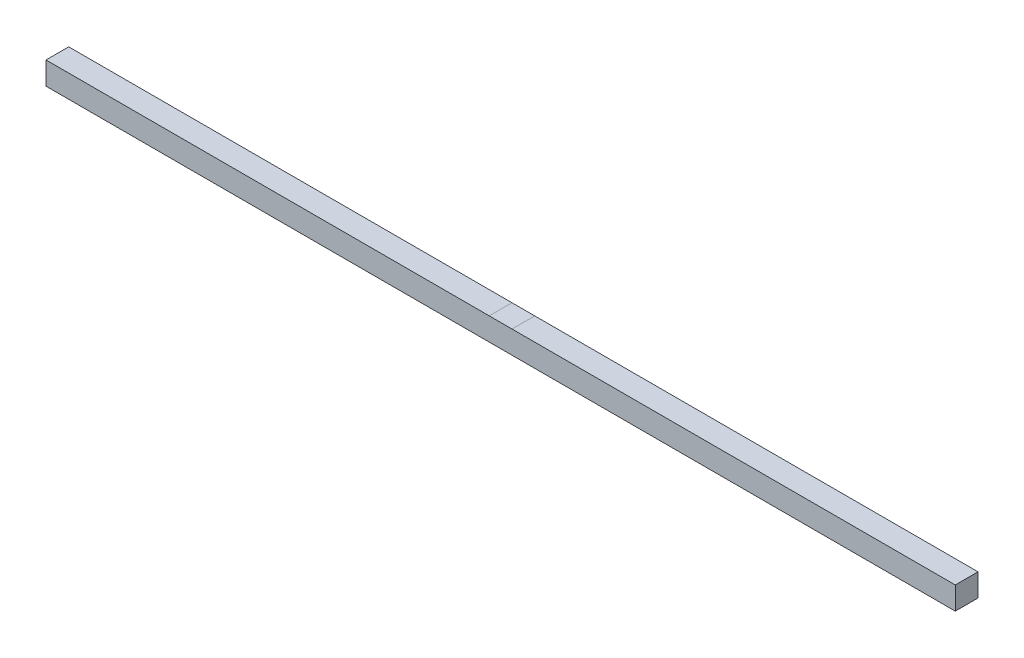
ISO-10303-21;
HEADER;
FILE_DESCRIPTION(('STEP AP214'),'2;1');
FILE_NAME('part.step','',(''),(''),'','','');
FILE_SCHEMA(('AUTOMOTIVE_DESIGN { 1 0 10303 214 1 1 1 1 }'));
ENDSEC;
DATA;
#1=APPLICATION_CONTEXT('core data for automotive mechanical design processes');
#2=APPLICATION_PROTOCOL_DEFINITION('international standard','automotive_design',2000,#1);
#3=PRODUCT_CONTEXT('',#1,'mechanical');
#4=PRODUCT('Part','Part','',(#3));
#5=PRODUCT_RELATED_PRODUCT_CATEGORY('part','',(#4));
#6=PRODUCT_DEFINITION_FORMATION('','',#4);
#7=PRODUCT_DEFINITION_CONTEXT('part definition',#1,'design');
#8=PRODUCT_DEFINITION('design','',#6,#7);
#9=PRODUCT_DEFINITION_SHAPE('','',#8);
#10=(LENGTH_UNIT() NAMED_UNIT(*) SI_UNIT(.MILLI.,.METRE.));
#11=(NAMED_UNIT(*) PLANE_ANGLE_UNIT() SI_UNIT($,.RADIAN.));
#12=(NAMED_UNIT(*) SI_UNIT($,.STERADIAN.) SOLID_ANGLE_UNIT());
#13=UNCERTAINTY_MEASURE_WITH_UNIT(LENGTH_MEASURE(1.E-05),#10,'distance_accuracy_value','');
#14=(GEOMETRIC_REPRESENTATION_CONTEXT(3) GLOBAL_UNCERTAINTY_ASSIGNED_CONTEXT((#13)) GLOBAL_UNIT_ASSIGNED_CONTEXT((#10,
#11,#12)) REPRESENTATION_CONTEXT('',''));
#15=CARTESIAN_POINT('',(0.,0.,0.));
#16=DIRECTION('',(0.,0.,1.));
#17=DIRECTION('',(1.,0.,0.));
#18=AXIS2_PLACEMENT_3D('',#15,#16,#17);
#19=CARTESIAN_POINT('',(-76.2,50.8,50.8));
#20=DIRECTION('',(0.,-1.,0.));
#21=DIRECTION('',(0.,0.,-1.));
#22=AXIS2_PLACEMENT_3D('',#19,#20,#21);
#23=PLANE('',#22);
#24=DIRECTION('',(0.,0.,1.));
#25=VECTOR('',#24,1.);
#26=CARTESIAN_POINT('',(914.4,50.8,50.8));
#27=LINE('',#26,#25);
#28=CARTESIAN_POINT('',(914.4,50.8,0.));
#29=VERTEX_POINT('',#28);
#30=CARTESIAN_POINT('',(914.4,50.8,50.8));
#31=VERTEX_POINT('',#30);
#32=EDGE_CURVE('E11',#29,#31,#27,.T.);
#33=ORIENTED_EDGE('',*,*,#32,.F.);
#34=DIRECTION('',(-1.,0.,0.));
#35=VECTOR('',#34,1.);
#36=CARTESIAN_POINT('',(-76.2,50.8,0.));
#37=LINE('',#36,#35);
#38=CARTESIAN_POINT('',(-76.2,50.8,0.));
#39=VERTEX_POINT('',#38);
#40=EDGE_CURVE('E133',#29,#39,#37,.T.);
#41=ORIENTED_EDGE('',*,*,#40,.T.);
#42=DIRECTION('',(0.,0.,-1.));
#43=VECTOR('',#42,1.);
#44=CARTESIAN_POINT('',(-76.2,50.8,50.8));
#45=LINE('',#44,#43);
#46=CARTESIAN_POINT('',(-76.2,50.8,50.8));
#47=VERTEX_POINT('',#46);
#48=EDGE_CURVE('E128',#47,#39,#45,.T.);
#49=ORIENTED_EDGE('',*,*,#48,.F.);
#50=DIRECTION('',(-1.,0.,0.));
#51=VECTOR('',#50,1.);
#52=CARTESIAN_POINT('',(-76.2,50.8,50.8));
#53=LINE('',#52,#51);
#54=EDGE_CURVE('E109',#31,#47,#53,.T.);
#55=ORIENTED_EDGE('',*,*,#54,.F.);
#56=EDGE_LOOP('',(#33,#41,#49,#55));
#57=FACE_BOUND('',#56,.T.);
#58=ADVANCED_FACE('F41',(#57),#23,.F.);
#59=DIRECTION('',(0.,0.,-1.));
#60=VECTOR('',#59,1.);
#61=CARTESIAN_POINT('',(965.2,50.8,50.8));
#62=LINE('',#61,#60);
#63=CARTESIAN_POINT('',(965.2,50.8,50.8));
#64=VERTEX_POINT('',#63);
#65=CARTESIAN_POINT('',(965.2,50.8,0.));
#66=VERTEX_POINT('',#65);
#67=EDGE_CURVE('E50',#64,#66,#62,.T.);
#68=ORIENTED_EDGE('',*,*,#67,.F.);
#69=CARTESIAN_POINT('',(1955.8,50.8,50.8));
#70=VERTEX_POINT('',#69);
#71=EDGE_CURVE('E130',#70,#64,#53,.T.);
#72=ORIENTED_EDGE('',*,*,#71,.F.);
#73=DIRECTION('',(0.,0.,-1.));
#74=VECTOR('',#73,1.);
#75=CARTESIAN_POINT('',(1955.8,50.8,50.8));
#76=LINE('',#75,#74);
#77=CARTESIAN_POINT('',(1955.8,50.8,0.));
#78=VERTEX_POINT('',#77);
#79=EDGE_CURVE('E123',#70,#78,#76,.T.);
#80=ORIENTED_EDGE('',*,*,#79,.T.);
#81=EDGE_CURVE('E113',#78,#66,#37,.T.);
#82=ORIENTED_EDGE('',*,*,#81,.T.);
#83=EDGE_LOOP('',(#68,#72,#80,#82));
#84=FACE_BOUND('',#83,.T.);
#85=ADVANCED_FACE('F151',(#84),#23,.F.);
#86=CARTESIAN_POINT('',(-76.2,50.8,50.8));
#87=DIRECTION('',(1.,0.,0.));
#88=DIRECTION('',(0.,0.,-1.));
#89=AXIS2_PLACEMENT_3D('',#86,#87,#88);
#90=PLANE('',#89);
#91=DIRECTION('',(0.,-1.,0.));
#92=VECTOR('',#91,1.);
#93=CARTESIAN_POINT('',(-76.2,50.8,0.));
#94=LINE('',#93,#92);
#95=CARTESIAN_POINT('',(-76.2,0.,0.));
#96=VERTEX_POINT('',#95);
#97=EDGE_CURVE('E116',#39,#96,#94,.T.);
#98=ORIENTED_EDGE('',*,*,#97,.T.);
#99=DIRECTION('',(0.,0.,-1.));
#100=VECTOR('',#99,1.);
#101=CARTESIAN_POINT('',(-76.2,0.,50.8));
#102=LINE('',#101,#100);
#103=CARTESIAN_POINT('',(-76.2,0.,50.8));
#104=VERTEX_POINT('',#103);
#105=EDGE_CURVE('E97',#104,#96,#102,.T.);
#106=ORIENTED_EDGE('',*,*,#105,.F.);
#107=DIRECTION('',(0.,-1.,0.));
#108=VECTOR('',#107,1.);
#109=CARTESIAN_POINT('',(-76.2,50.8,50.8));
#110=LINE('',#109,#108);
#111=EDGE_CURVE('E104',#47,#104,#110,.T.);
#112=ORIENTED_EDGE('',*,*,#111,.F.);
#113=ORIENTED_EDGE('',*,*,#48,.T.);
#114=EDGE_LOOP('',(#98,#106,#112,#113));
#115=FACE_BOUND('',#114,.T.);
#116=ADVANCED_FACE('F43',(#115),#90,.F.);
#117=CARTESIAN_POINT('',(-76.2,0.,50.8));
#118=DIRECTION('',(0.,1.,0.));
#119=DIRECTION('',(-1.,0.,0.));
#120=AXIS2_PLACEMENT_3D('',#117,#118,#119);
#121=PLANE('',#120);
#122=DIRECTION('',(1.,0.,0.));
#123=VECTOR('',#122,1.);
#124=CARTESIAN_POINT('',(-76.2,0.,0.));
#125=LINE('',#124,#123);
#126=CARTESIAN_POINT('',(1955.8,0.,0.));
#127=VERTEX_POINT('',#126);
#128=EDGE_CURVE('E137',#96,#127,#125,.T.);
#129=ORIENTED_EDGE('',*,*,#128,.T.);
#130=DIRECTION('',(0.,0.,-1.));
#131=VECTOR('',#130,1.);
#132=CARTESIAN_POINT('',(1955.8,0.,50.8));
#133=LINE('',#132,#131);
#134=CARTESIAN_POINT('',(1955.8,0.,50.8));
#135=VERTEX_POINT('',#134);
#136=EDGE_CURVE('E100',#135,#127,#133,.T.);
#137=ORIENTED_EDGE('',*,*,#136,.F.);
#138=DIRECTION('',(1.,0.,0.));
#139=VECTOR('',#138,1.);
#140=CARTESIAN_POINT('',(-76.2,0.,50.8));
#141=LINE('',#140,#139);
#142=EDGE_CURVE('E93',#104,#135,#141,.T.);
#143=ORIENTED_EDGE('',*,*,#142,.F.);
#144=ORIENTED_EDGE('',*,*,#105,.T.);
#145=EDGE_LOOP('',(#129,#137,#143,#144));
#146=FACE_BOUND('',#145,.T.);
#147=ADVANCED_FACE('F95',(#146),#121,.F.);
#148=CARTESIAN_POINT('',(1955.8,50.8,50.8));
#149=DIRECTION('',(-1.,0.,0.));
#150=DIRECTION('',(0.,0.,1.));
#151=AXIS2_PLACEMENT_3D('',#148,#149,#150);
#152=PLANE('',#151);
#153=DIRECTION('',(0.,1.,0.));
#154=VECTOR('',#153,1.);
#155=CARTESIAN_POINT('',(1955.8,50.8,0.));
#156=LINE('',#155,#154);
#157=EDGE_CURVE('E134',#127,#78,#156,.T.);
#158=ORIENTED_EDGE('',*,*,#157,.T.);
#159=ORIENTED_EDGE('',*,*,#79,.F.);
#160=DIRECTION('',(0.,1.,0.));
#161=VECTOR('',#160,1.);
#162=CARTESIAN_POINT('',(1955.8,50.8,50.8));
#163=LINE('',#162,#161);
#164=EDGE_CURVE('E103',#135,#70,#163,.T.);
#165=ORIENTED_EDGE('',*,*,#164,.F.);
#166=ORIENTED_EDGE('',*,*,#136,.T.);
#167=EDGE_LOOP('',(#158,#159,#165,#166));
#168=FACE_BOUND('',#167,.T.);
#169=ADVANCED_FACE('F153',(#168),#152,.F.);
#170=EDGE_CURVE('E132',#66,#29,#37,.T.);
#171=ORIENTED_EDGE('',*,*,#170,.T.);
#172=ORIENTED_EDGE('',*,*,#32,.T.);
#173=EDGE_CURVE('E142',#64,#31,#53,.T.);
#174=ORIENTED_EDGE('',*,*,#173,.F.);
#175=ORIENTED_EDGE('',*,*,#67,.T.);
#176=EDGE_LOOP('',(#171,#172,#174,#175));
#177=FACE_BOUND('',#176,.T.);
#178=ADVANCED_FACE('F144',(#177),#23,.F.);
#179=CARTESIAN_POINT('',(-76.2,50.8,50.8));
#180=DIRECTION('',(0.,0.,1.));
#181=DIRECTION('',(1.,0.,0.));
#182=AXIS2_PLACEMENT_3D('',#179,#180,#181);
#183=PLANE('',#182);
#184=ORIENTED_EDGE('',*,*,#111,.T.);
#185=ORIENTED_EDGE('',*,*,#142,.T.);
#186=ORIENTED_EDGE('',*,*,#164,.T.);
#187=ORIENTED_EDGE('',*,*,#71,.T.);
#188=ORIENTED_EDGE('',*,*,#173,.T.);
#189=ORIENTED_EDGE('',*,*,#54,.T.);
#190=EDGE_LOOP('',(#184,#185,#186,#187,#188,#189));
#191=FACE_BOUND('',#190,.T.);
#192=ADVANCED_FACE('F107',(#191),#183,.T.);
#193=CARTESIAN_POINT('',(-76.2,50.8,0.));
#194=DIRECTION('',(0.,0.,1.));
#195=DIRECTION('',(1.,0.,0.));
#196=AXIS2_PLACEMENT_3D('',#193,#194,#195);
#197=PLANE('',#196);
#198=ORIENTED_EDGE('',*,*,#97,.F.);
#199=ORIENTED_EDGE('',*,*,#40,.F.);
#200=ORIENTED_EDGE('',*,*,#170,.F.);
#201=ORIENTED_EDGE('',*,*,#81,.F.);
#202=ORIENTED_EDGE('',*,*,#157,.F.);
#203=ORIENTED_EDGE('',*,*,#128,.F.);
#204=EDGE_LOOP('',(#198,#199,#200,#201,#202,#203));
#205=FACE_BOUND('',#204,.T.);
#206=ADVANCED_FACE('F149',(#205),#197,.F.);
#207=CLOSED_SHELL('',(#58,#85,#116,#147,#169,#178,#192,#206));
#208=MANIFOLD_SOLID_BREP('B2',#207);
#209=ADVANCED_BREP_SHAPE_REPRESENTATION('',(#18,#208),#14);
#210=SHAPE_DEFINITION_REPRESENTATION(#9,#209);
ENDSEC;
END-ISO-10303-21;
